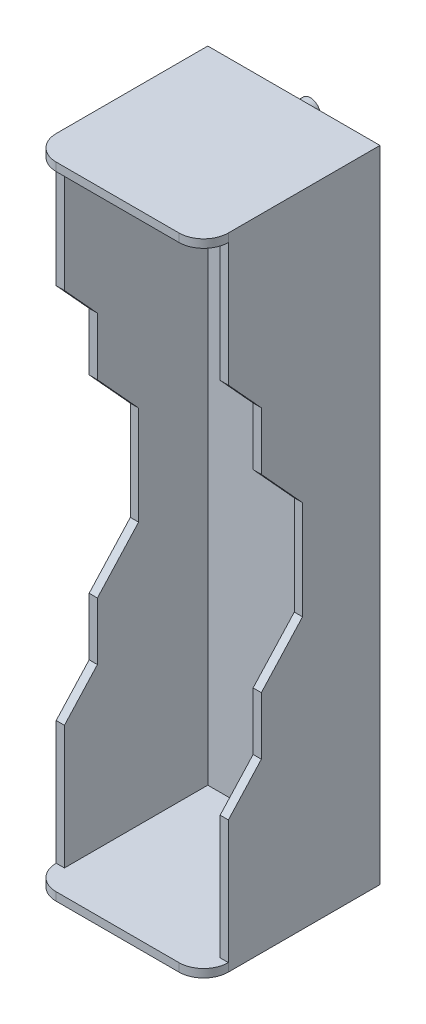
ISO-10303-21;
HEADER;
FILE_DESCRIPTION(('STEP AP214'),'2;1');
FILE_NAME('part.step','',(''),(''),'','','');
FILE_SCHEMA(('AUTOMOTIVE_DESIGN { 1 0 10303 214 1 1 1 1 }'));
ENDSEC;
DATA;
#1=APPLICATION_CONTEXT('core data for automotive mechanical design processes');
#2=APPLICATION_PROTOCOL_DEFINITION('international standard','automotive_design',2000,#1);
#3=PRODUCT_CONTEXT('',#1,'mechanical');
#4=PRODUCT('Part','Part','',(#3));
#5=PRODUCT_RELATED_PRODUCT_CATEGORY('part','',(#4));
#6=PRODUCT_DEFINITION_FORMATION('','',#4);
#7=PRODUCT_DEFINITION_CONTEXT('part definition',#1,'design');
#8=PRODUCT_DEFINITION('design','',#6,#7);
#9=PRODUCT_DEFINITION_SHAPE('','',#8);
#10=(LENGTH_UNIT() NAMED_UNIT(*) SI_UNIT(.MILLI.,.METRE.));
#11=(NAMED_UNIT(*) PLANE_ANGLE_UNIT() SI_UNIT($,.RADIAN.));
#12=(NAMED_UNIT(*) SI_UNIT($,.STERADIAN.) SOLID_ANGLE_UNIT());
#13=UNCERTAINTY_MEASURE_WITH_UNIT(LENGTH_MEASURE(1.E-05),#10,'distance_accuracy_value','');
#14=(GEOMETRIC_REPRESENTATION_CONTEXT(3) GLOBAL_UNCERTAINTY_ASSIGNED_CONTEXT((#13)) GLOBAL_UNIT_ASSIGNED_CONTEXT((#10,
#11,#12)) REPRESENTATION_CONTEXT('',''));
#15=CARTESIAN_POINT('',(0.,0.,0.));
#16=DIRECTION('',(0.,0.,1.));
#17=DIRECTION('',(1.,0.,0.));
#18=AXIS2_PLACEMENT_3D('',#15,#16,#17);
#19=CARTESIAN_POINT('',(-10.45,38.85,-21.4));
#20=DIRECTION('',(0.,0.,1.));
#21=DIRECTION('',(1.,0.,0.));
#22=AXIS2_PLACEMENT_3D('',#19,#20,#21);
#23=PLANE('',#22);
#24=CARTESIAN_POINT('',(0.,27.805,-21.4));
#25=DIRECTION('',(0.,0.,-1.));
#26=DIRECTION('',(1.,0.,0.));
#27=AXIS2_PLACEMENT_3D('',#24,#25,#26);
#28=CIRCLE('',#27,1.6);
#29=CARTESIAN_POINT('',(1.60000000000001,27.805,-21.4));
#30=VERTEX_POINT('',#29);
#31=EDGE_CURVE('E327',#30,#30,#28,.T.);
#32=ORIENTED_EDGE('',*,*,#31,.F.);
#33=EDGE_LOOP('',(#32));
#34=FACE_BOUND('',#33,.T.);
#35=CARTESIAN_POINT('',(0.,-27.805,-21.4));
#36=DIRECTION('',(0.,0.,-1.));
#37=DIRECTION('',(-1.,0.,0.));
#38=AXIS2_PLACEMENT_3D('',#35,#36,#37);
#39=CIRCLE('',#38,1.6);
#40=CARTESIAN_POINT('',(-1.6,-27.805,-21.4));
#41=VERTEX_POINT('',#40);
#42=EDGE_CURVE('E326',#41,#41,#39,.T.);
#43=ORIENTED_EDGE('',*,*,#42,.F.);
#44=EDGE_LOOP('',(#43));
#45=FACE_BOUND('',#44,.T.);
#46=DIRECTION('',(-1.,0.,0.));
#47=VECTOR('',#46,1.);
#48=CARTESIAN_POINT('',(-10.45,-38.85,-21.4));
#49=LINE('',#48,#47);
#50=CARTESIAN_POINT('',(10.45,-38.85,-21.4));
#51=VERTEX_POINT('',#50);
#52=CARTESIAN_POINT('',(-10.45,-38.85,-21.4));
#53=VERTEX_POINT('',#52);
#54=EDGE_CURVE('E361',#51,#53,#49,.T.);
#55=ORIENTED_EDGE('',*,*,#54,.T.);
#56=DIRECTION('',(0.,-1.,0.));
#57=VECTOR('',#56,1.);
#58=CARTESIAN_POINT('',(-10.45,38.85,-21.4));
#59=LINE('',#58,#57);
#60=CARTESIAN_POINT('',(-10.45,38.85,-21.4));
#61=VERTEX_POINT('',#60);
#62=EDGE_CURVE('E358',#61,#53,#59,.T.);
#63=ORIENTED_EDGE('',*,*,#62,.F.);
#64=DIRECTION('',(-1.,0.,0.));
#65=VECTOR('',#64,1.);
#66=CARTESIAN_POINT('',(-10.45,38.85,-21.4));
#67=LINE('',#66,#65);
#68=CARTESIAN_POINT('',(10.45,38.85,-21.4));
#69=VERTEX_POINT('',#68);
#70=EDGE_CURVE('E360',#69,#61,#67,.T.);
#71=ORIENTED_EDGE('',*,*,#70,.F.);
#72=DIRECTION('',(0.,-1.,0.));
#73=VECTOR('',#72,1.);
#74=CARTESIAN_POINT('',(10.45,38.85,-21.4));
#75=LINE('',#74,#73);
#76=EDGE_CURVE('E355',#69,#51,#75,.T.);
#77=ORIENTED_EDGE('',*,*,#76,.T.);
#78=EDGE_LOOP('',(#55,#63,#71,#77));
#79=FACE_BOUND('',#78,.T.);
#80=CARTESIAN_POINT('',(0.,-36.45,-21.4));
#81=DIRECTION('',(0.,0.,1.));
#82=DIRECTION('',(1.,0.,0.));
#83=AXIS2_PLACEMENT_3D('',#80,#81,#82);
#84=CIRCLE('',#83,1.2);
#85=CARTESIAN_POINT('',(1.2,-36.45,-21.4));
#86=VERTEX_POINT('',#85);
#87=EDGE_CURVE('E334',#86,#86,#84,.F.);
#88=ORIENTED_EDGE('',*,*,#87,.F.);
#89=EDGE_LOOP('',(#88));
#90=FACE_BOUND('',#89,.T.);
#91=CARTESIAN_POINT('',(0.,36.45,-21.4));
#92=DIRECTION('',(0.,0.,1.));
#93=DIRECTION('',(1.,0.,0.));
#94=AXIS2_PLACEMENT_3D('',#91,#92,#93);
#95=CIRCLE('',#94,1.2);
#96=CARTESIAN_POINT('',(1.2,36.45,-21.4));
#97=VERTEX_POINT('',#96);
#98=EDGE_CURVE('E322',#97,#97,#95,.F.);
#99=ORIENTED_EDGE('',*,*,#98,.F.);
#100=EDGE_LOOP('',(#99));
#101=FACE_BOUND('',#100,.T.);
#102=ADVANCED_FACE('F35',(#34,#45,#79,#90,#101),#23,.F.);
#103=CARTESIAN_POINT('',(-10.45,38.85,0.));
#104=DIRECTION('',(0.,0.,-1.));
#105=DIRECTION('',(-1.,0.,0.));
#106=AXIS2_PLACEMENT_3D('',#103,#104,#105);
#107=PLANE('',#106);
#108=DIRECTION('',(1.,0.,0.));
#109=VECTOR('',#108,1.);
#110=CARTESIAN_POINT('',(-10.45,38.85,0.));
#111=LINE('',#110,#109);
#112=CARTESIAN_POINT('',(-7.45,38.85,0.));
#113=VERTEX_POINT('',#112);
#114=CARTESIAN_POINT('',(7.45,38.85,0.));
#115=VERTEX_POINT('',#114);
#116=EDGE_CURVE('E373',#113,#115,#111,.T.);
#117=ORIENTED_EDGE('',*,*,#116,.F.);
#118=DIRECTION('',(0.,-1.,0.));
#119=VECTOR('',#118,1.);
#120=CARTESIAN_POINT('',(-7.45,38.85,0.));
#121=LINE('',#120,#119);
#122=CARTESIAN_POINT('',(-7.45,37.85,0.));
#123=VERTEX_POINT('',#122);
#124=EDGE_CURVE('E317',#113,#123,#121,.T.);
#125=ORIENTED_EDGE('',*,*,#124,.T.);
#126=DIRECTION('',(1.,0.,0.));
#127=VECTOR('',#126,1.);
#128=CARTESIAN_POINT('',(-9.45,37.85,0.));
#129=LINE('',#128,#127);
#130=CARTESIAN_POINT('',(7.45,37.85,0.));
#131=VERTEX_POINT('',#130);
#132=EDGE_CURVE('E392',#123,#131,#129,.T.);
#133=ORIENTED_EDGE('',*,*,#132,.T.);
#134=DIRECTION('',(0.,-1.,0.));
#135=VECTOR('',#134,1.);
#136=CARTESIAN_POINT('',(7.45,38.85,0.));
#137=LINE('',#136,#135);
#138=EDGE_CURVE('E320',#131,#115,#137,.F.);
#139=ORIENTED_EDGE('',*,*,#138,.T.);
#140=EDGE_LOOP('',(#117,#125,#133,#139));
#141=FACE_BOUND('',#140,.T.);
#142=ADVANCED_FACE('F506',(#141),#107,.F.);
#143=DIRECTION('',(-1.,0.,0.));
#144=VECTOR('',#143,1.);
#145=CARTESIAN_POINT('',(-9.45000000000001,-37.85,0.));
#146=LINE('',#145,#144);
#147=CARTESIAN_POINT('',(7.45,-37.85,0.));
#148=VERTEX_POINT('',#147);
#149=CARTESIAN_POINT('',(-7.45,-37.85,0.));
#150=VERTEX_POINT('',#149);
#151=EDGE_CURVE('E281',#148,#150,#146,.T.);
#152=ORIENTED_EDGE('',*,*,#151,.T.);
#153=DIRECTION('',(0.,-1.,0.));
#154=VECTOR('',#153,1.);
#155=CARTESIAN_POINT('',(-7.45,38.85,0.));
#156=LINE('',#155,#154);
#157=CARTESIAN_POINT('',(-7.45,-38.85,0.));
#158=VERTEX_POINT('',#157);
#159=EDGE_CURVE('E268',#150,#158,#156,.T.);
#160=ORIENTED_EDGE('',*,*,#159,.T.);
#161=DIRECTION('',(1.,0.,0.));
#162=VECTOR('',#161,1.);
#163=CARTESIAN_POINT('',(-10.45,-38.85,0.));
#164=LINE('',#163,#162);
#165=CARTESIAN_POINT('',(7.45,-38.85,0.));
#166=VERTEX_POINT('',#165);
#167=EDGE_CURVE('E366',#158,#166,#164,.T.);
#168=ORIENTED_EDGE('',*,*,#167,.T.);
#169=DIRECTION('',(0.,-1.,0.));
#170=VECTOR('',#169,1.);
#171=CARTESIAN_POINT('',(7.45,38.85,0.));
#172=LINE('',#171,#170);
#173=EDGE_CURVE('E270',#166,#148,#172,.F.);
#174=ORIENTED_EDGE('',*,*,#173,.T.);
#175=EDGE_LOOP('',(#152,#160,#168,#174));
#176=FACE_BOUND('',#175,.T.);
#177=ADVANCED_FACE('F608',(#176),#107,.F.);
#178=CARTESIAN_POINT('',(-10.45,38.85,-21.4));
#179=DIRECTION('',(1.,0.,0.));
#180=DIRECTION('',(0.,0.,-1.));
#181=AXIS2_PLACEMENT_3D('',#178,#179,#180);
#182=PLANE('',#181);
#183=DIRECTION('',(0.,1.,0.));
#184=VECTOR('',#183,1.);
#185=CARTESIAN_POINT('',(-10.45,37.85,-3.));
#186=LINE('',#185,#184);
#187=CARTESIAN_POINT('',(-10.45,22.85,-3.));
#188=VERTEX_POINT('',#187);
#189=CARTESIAN_POINT('',(-10.45,37.85,-3.));
#190=VERTEX_POINT('',#189);
#191=EDGE_CURVE('E295',#188,#190,#186,.T.);
#192=ORIENTED_EDGE('',*,*,#191,.T.);
#193=DIRECTION('',(0.,-1.,0.));
#194=VECTOR('',#193,1.);
#195=CARTESIAN_POINT('',(-10.45,38.85,-3.));
#196=LINE('',#195,#194);
#197=CARTESIAN_POINT('',(-10.45,38.85,-3.));
#198=VERTEX_POINT('',#197);
#199=EDGE_CURVE('E244',#190,#198,#196,.F.);
#200=ORIENTED_EDGE('',*,*,#199,.T.);
#201=DIRECTION('',(0.,0.,1.));
#202=VECTOR('',#201,1.);
#203=CARTESIAN_POINT('',(-10.45,38.85,-21.4));
#204=LINE('',#203,#202);
#205=EDGE_CURVE('E363',#61,#198,#204,.T.);
#206=ORIENTED_EDGE('',*,*,#205,.F.);
#207=ORIENTED_EDGE('',*,*,#62,.T.);
#208=DIRECTION('',(0.,0.,1.));
#209=VECTOR('',#208,1.);
#210=CARTESIAN_POINT('',(-10.45,-38.85,-21.4));
#211=LINE('',#210,#209);
#212=CARTESIAN_POINT('',(-10.45,-38.85,-3.));
#213=VERTEX_POINT('',#212);
#214=EDGE_CURVE('E242',#53,#213,#211,.T.);
#215=ORIENTED_EDGE('',*,*,#214,.T.);
#216=DIRECTION('',(0.,-1.,0.));
#217=VECTOR('',#216,1.);
#218=CARTESIAN_POINT('',(-10.45,38.85,-3.));
#219=LINE('',#218,#217);
#220=CARTESIAN_POINT('',(-10.45,-37.85,-3.));
#221=VERTEX_POINT('',#220);
#222=EDGE_CURVE('E233',#213,#221,#219,.F.);
#223=ORIENTED_EDGE('',*,*,#222,.T.);
#224=DIRECTION('',(0.,1.,0.));
#225=VECTOR('',#224,1.);
#226=CARTESIAN_POINT('',(-10.45,-37.85,-3.));
#227=LINE('',#226,#225);
#228=CARTESIAN_POINT('',(-10.45,-22.85,-3.));
#229=VERTEX_POINT('',#228);
#230=EDGE_CURVE('E239',#221,#229,#227,.T.);
#231=ORIENTED_EDGE('',*,*,#230,.T.);
#232=DIRECTION('',(0.,0.738242056578347,-0.674535889259403));
#233=VECTOR('',#232,1.);
#234=CARTESIAN_POINT('',(-10.45,-22.85,-3.));
#235=LINE('',#234,#233);
#236=CARTESIAN_POINT('',(-10.45,-18.4722222222222,-7.));
#237=VERTEX_POINT('',#236);
#238=EDGE_CURVE('E264',#229,#237,#235,.T.);
#239=ORIENTED_EDGE('',*,*,#238,.T.);
#240=DIRECTION('',(0.,1.,0.));
#241=VECTOR('',#240,1.);
#242=CARTESIAN_POINT('',(-10.45,-18.4722222222222,-7.));
#243=LINE('',#242,#241);
#244=CARTESIAN_POINT('',(-10.45,-11.4722222222222,-7.));
#245=VERTEX_POINT('',#244);
#246=EDGE_CURVE('E489',#237,#245,#243,.T.);
#247=ORIENTED_EDGE('',*,*,#246,.T.);
#248=DIRECTION('',(0.,0.738242056578347,-0.674535889259403));
#249=VECTOR('',#248,1.);
#250=CARTESIAN_POINT('',(-10.45,-11.4722222222222,-7.));
#251=LINE('',#250,#249);
#252=CARTESIAN_POINT('',(-10.45,-6.,-12.));
#253=VERTEX_POINT('',#252);
#254=EDGE_CURVE('E486',#245,#253,#251,.T.);
#255=ORIENTED_EDGE('',*,*,#254,.T.);
#256=DIRECTION('',(0.,1.,0.));
#257=VECTOR('',#256,1.);
#258=CARTESIAN_POINT('',(-10.45,6.,-12.));
#259=LINE('',#258,#257);
#260=CARTESIAN_POINT('',(-10.45,6.,-12.));
#261=VERTEX_POINT('',#260);
#262=EDGE_CURVE('E483',#253,#261,#259,.T.);
#263=ORIENTED_EDGE('',*,*,#262,.T.);
#264=DIRECTION('',(0.,0.738242056578347,0.674535889259403));
#265=VECTOR('',#264,1.);
#266=CARTESIAN_POINT('',(-10.45,11.4722222222222,-7.));
#267=LINE('',#266,#265);
#268=CARTESIAN_POINT('',(-10.45,11.4722222222222,-7.));
#269=VERTEX_POINT('',#268);
#270=EDGE_CURVE('E480',#261,#269,#267,.T.);
#271=ORIENTED_EDGE('',*,*,#270,.T.);
#272=DIRECTION('',(0.,1.,0.));
#273=VECTOR('',#272,1.);
#274=CARTESIAN_POINT('',(-10.45,18.4722222222222,-7.));
#275=LINE('',#274,#273);
#276=CARTESIAN_POINT('',(-10.45,18.4722222222222,-7.));
#277=VERTEX_POINT('',#276);
#278=EDGE_CURVE('E477',#269,#277,#275,.T.);
#279=ORIENTED_EDGE('',*,*,#278,.T.);
#280=DIRECTION('',(0.,0.738242056578347,0.674535889259403));
#281=VECTOR('',#280,1.);
#282=CARTESIAN_POINT('',(-10.45,22.85,-3.));
#283=LINE('',#282,#281);
#284=EDGE_CURVE('E474',#277,#188,#283,.T.);
#285=ORIENTED_EDGE('',*,*,#284,.T.);
#286=EDGE_LOOP('',(#192,#200,#206,#207,#215,#223,#231,#239,#247,#255,#263,#271,#279,#285));
#287=FACE_BOUND('',#286,.T.);
#288=ADVANCED_FACE('F236',(#287),#182,.F.);
#289=CARTESIAN_POINT('',(10.45,38.85,-21.4));
#290=DIRECTION('',(-1.,0.,0.));
#291=DIRECTION('',(0.,0.,1.));
#292=AXIS2_PLACEMENT_3D('',#289,#290,#291);
#293=PLANE('',#292);
#294=DIRECTION('',(0.,0.,-1.));
#295=VECTOR('',#294,1.);
#296=CARTESIAN_POINT('',(10.45,38.85,-21.4));
#297=LINE('',#296,#295);
#298=CARTESIAN_POINT('',(10.45,38.85,-3.));
#299=VERTEX_POINT('',#298);
#300=EDGE_CURVE('E371',#299,#69,#297,.T.);
#301=ORIENTED_EDGE('',*,*,#300,.F.);
#302=DIRECTION('',(0.,-1.,0.));
#303=VECTOR('',#302,1.);
#304=CARTESIAN_POINT('',(10.45,38.85,-3.));
#305=LINE('',#304,#303);
#306=CARTESIAN_POINT('',(10.45,37.85,-3.));
#307=VERTEX_POINT('',#306);
#308=EDGE_CURVE('E273',#299,#307,#305,.T.);
#309=ORIENTED_EDGE('',*,*,#308,.T.);
#310=DIRECTION('',(0.,1.,0.));
#311=VECTOR('',#310,1.);
#312=CARTESIAN_POINT('',(10.45,37.85,-3.));
#313=LINE('',#312,#311);
#314=CARTESIAN_POINT('',(10.45,22.85,-3.));
#315=VERTEX_POINT('',#314);
#316=EDGE_CURVE('E265',#315,#307,#313,.T.);
#317=ORIENTED_EDGE('',*,*,#316,.F.);
#318=DIRECTION('',(0.,0.738242056578347,0.674535889259403));
#319=VECTOR('',#318,1.);
#320=CARTESIAN_POINT('',(10.45,22.85,-3.));
#321=LINE('',#320,#319);
#322=CARTESIAN_POINT('',(10.45,18.4722222222222,-7.));
#323=VERTEX_POINT('',#322);
#324=EDGE_CURVE('E454',#323,#315,#321,.T.);
#325=ORIENTED_EDGE('',*,*,#324,.F.);
#326=DIRECTION('',(0.,1.,0.));
#327=VECTOR('',#326,1.);
#328=CARTESIAN_POINT('',(10.45,18.4722222222222,-7.));
#329=LINE('',#328,#327);
#330=CARTESIAN_POINT('',(10.45,11.4722222222222,-7.));
#331=VERTEX_POINT('',#330);
#332=EDGE_CURVE('E457',#331,#323,#329,.T.);
#333=ORIENTED_EDGE('',*,*,#332,.F.);
#334=DIRECTION('',(0.,0.738242056578347,0.674535889259403));
#335=VECTOR('',#334,1.);
#336=CARTESIAN_POINT('',(10.45,11.4722222222222,-7.));
#337=LINE('',#336,#335);
#338=CARTESIAN_POINT('',(10.45,6.,-12.));
#339=VERTEX_POINT('',#338);
#340=EDGE_CURVE('E460',#339,#331,#337,.T.);
#341=ORIENTED_EDGE('',*,*,#340,.F.);
#342=DIRECTION('',(0.,1.,0.));
#343=VECTOR('',#342,1.);
#344=CARTESIAN_POINT('',(10.45,6.,-12.));
#345=LINE('',#344,#343);
#346=CARTESIAN_POINT('',(10.45,-6.,-12.));
#347=VERTEX_POINT('',#346);
#348=EDGE_CURVE('E463',#347,#339,#345,.T.);
#349=ORIENTED_EDGE('',*,*,#348,.F.);
#350=DIRECTION('',(0.,0.738242056578347,-0.674535889259403));
#351=VECTOR('',#350,1.);
#352=CARTESIAN_POINT('',(10.45,-11.4722222222222,-7.));
#353=LINE('',#352,#351);
#354=CARTESIAN_POINT('',(10.45,-11.4722222222222,-7.));
#355=VERTEX_POINT('',#354);
#356=EDGE_CURVE('E466',#355,#347,#353,.T.);
#357=ORIENTED_EDGE('',*,*,#356,.F.);
#358=DIRECTION('',(0.,1.,0.));
#359=VECTOR('',#358,1.);
#360=CARTESIAN_POINT('',(10.45,-18.4722222222222,-7.));
#361=LINE('',#360,#359);
#362=CARTESIAN_POINT('',(10.45,-18.4722222222222,-7.));
#363=VERTEX_POINT('',#362);
#364=EDGE_CURVE('E469',#363,#355,#361,.T.);
#365=ORIENTED_EDGE('',*,*,#364,.F.);
#366=DIRECTION('',(0.,0.738242056578347,-0.674535889259403));
#367=VECTOR('',#366,1.);
#368=CARTESIAN_POINT('',(10.45,-22.85,-3.));
#369=LINE('',#368,#367);
#370=CARTESIAN_POINT('',(10.45,-22.85,-3.));
#371=VERTEX_POINT('',#370);
#372=EDGE_CURVE('E303',#371,#363,#369,.T.);
#373=ORIENTED_EDGE('',*,*,#372,.F.);
#374=DIRECTION('',(0.,1.,0.));
#375=VECTOR('',#374,1.);
#376=CARTESIAN_POINT('',(10.45,-37.85,-3.));
#377=LINE('',#376,#375);
#378=CARTESIAN_POINT('',(10.45,-37.85,-3.));
#379=VERTEX_POINT('',#378);
#380=EDGE_CURVE('E290',#379,#371,#377,.T.);
#381=ORIENTED_EDGE('',*,*,#380,.F.);
#382=DIRECTION('',(0.,-1.,0.));
#383=VECTOR('',#382,1.);
#384=CARTESIAN_POINT('',(10.45,38.85,-3.));
#385=LINE('',#384,#383);
#386=CARTESIAN_POINT('',(10.45,-38.85,-3.));
#387=VERTEX_POINT('',#386);
#388=EDGE_CURVE('E300',#379,#387,#385,.T.);
#389=ORIENTED_EDGE('',*,*,#388,.T.);
#390=DIRECTION('',(0.,0.,-1.));
#391=VECTOR('',#390,1.);
#392=CARTESIAN_POINT('',(10.45,-38.85,-21.4));
#393=LINE('',#392,#391);
#394=EDGE_CURVE('E364',#387,#51,#393,.T.);
#395=ORIENTED_EDGE('',*,*,#394,.T.);
#396=ORIENTED_EDGE('',*,*,#76,.F.);
#397=EDGE_LOOP('',(#301,#309,#317,#325,#333,#341,#349,#357,#365,#373,#381,#389,#395,#396));
#398=FACE_BOUND('',#397,.T.);
#399=ADVANCED_FACE('F299',(#398),#293,.F.);
#400=CARTESIAN_POINT('',(0.,38.85,0.));
#401=DIRECTION('',(0.,1.,0.));
#402=DIRECTION('',(0.,0.,1.));
#403=AXIS2_PLACEMENT_3D('',#400,#401,#402);
#404=PLANE('',#403);
#405=ORIENTED_EDGE('',*,*,#205,.T.);
#406=CARTESIAN_POINT('',(-7.45,38.85,-3.));
#407=DIRECTION('',(0.,1.,0.));
#408=DIRECTION('',(0.,0.,1.));
#409=AXIS2_PLACEMENT_3D('',#406,#407,#408);
#410=CIRCLE('',#409,3.);
#411=EDGE_CURVE('E306',#198,#113,#410,.T.);
#412=ORIENTED_EDGE('',*,*,#411,.T.);
#413=ORIENTED_EDGE('',*,*,#116,.T.);
#414=CARTESIAN_POINT('',(7.45,38.85,-3.));
#415=DIRECTION('',(0.,1.,0.));
#416=DIRECTION('',(0.,0.,1.));
#417=AXIS2_PLACEMENT_3D('',#414,#415,#416);
#418=CIRCLE('',#417,3.);
#419=EDGE_CURVE('E309',#115,#299,#418,.T.);
#420=ORIENTED_EDGE('',*,*,#419,.T.);
#421=ORIENTED_EDGE('',*,*,#300,.T.);
#422=ORIENTED_EDGE('',*,*,#70,.T.);
#423=EDGE_LOOP('',(#405,#412,#413,#420,#421,#422));
#424=FACE_BOUND('',#423,.T.);
#425=ADVANCED_FACE('F600',(#424),#404,.T.);
#426=CARTESIAN_POINT('',(0.,-38.85,0.));
#427=DIRECTION('',(0.,1.,0.));
#428=DIRECTION('',(0.,0.,1.));
#429=AXIS2_PLACEMENT_3D('',#426,#427,#428);
#430=PLANE('',#429);
#431=ORIENTED_EDGE('',*,*,#167,.F.);
#432=CARTESIAN_POINT('',(-7.45,-38.85,-3.));
#433=DIRECTION('',(0.,1.,0.));
#434=DIRECTION('',(0.,0.,1.));
#435=AXIS2_PLACEMENT_3D('',#432,#433,#434);
#436=CIRCLE('',#435,3.);
#437=EDGE_CURVE('E58',#158,#213,#436,.F.);
#438=ORIENTED_EDGE('',*,*,#437,.T.);
#439=ORIENTED_EDGE('',*,*,#214,.F.);
#440=ORIENTED_EDGE('',*,*,#54,.F.);
#441=ORIENTED_EDGE('',*,*,#394,.F.);
#442=CARTESIAN_POINT('',(7.45,-38.85,-3.));
#443=DIRECTION('',(0.,1.,0.));
#444=DIRECTION('',(0.,0.,1.));
#445=AXIS2_PLACEMENT_3D('',#442,#443,#444);
#446=CIRCLE('',#445,3.);
#447=EDGE_CURVE('E50',#387,#166,#446,.F.);
#448=ORIENTED_EDGE('',*,*,#447,.T.);
#449=EDGE_LOOP('',(#431,#438,#439,#440,#441,#448));
#450=FACE_BOUND('',#449,.T.);
#451=ADVANCED_FACE('F589',(#450),#430,.F.);
#452=CARTESIAN_POINT('',(-9.45000000000001,-37.85,-99.4237143437814));
#453=DIRECTION('',(0.,1.,0.));
#454=DIRECTION('',(0.,0.,1.));
#455=AXIS2_PLACEMENT_3D('',#452,#453,#454);
#456=PLANE('',#455);
#457=DIRECTION('',(1.,0.,0.));
#458=VECTOR('',#457,1.);
#459=CARTESIAN_POINT('',(-10.45,-37.85,-3.));
#460=LINE('',#459,#458);
#461=CARTESIAN_POINT('',(-9.45000000000001,-37.85,-3.));
#462=VERTEX_POINT('',#461);
#463=EDGE_CURVE('E249',#221,#462,#460,.T.);
#464=ORIENTED_EDGE('',*,*,#463,.F.);
#465=CARTESIAN_POINT('',(-7.45,-37.85,-3.));
#466=DIRECTION('',(0.,1.,0.));
#467=DIRECTION('',(0.,0.,1.));
#468=AXIS2_PLACEMENT_3D('',#465,#466,#467);
#469=CIRCLE('',#468,3.);
#470=EDGE_CURVE('E12',#221,#150,#469,.T.);
#471=ORIENTED_EDGE('',*,*,#470,.T.);
#472=ORIENTED_EDGE('',*,*,#151,.F.);
#473=CARTESIAN_POINT('',(7.45,-37.85,-3.));
#474=DIRECTION('',(0.,1.,0.));
#475=DIRECTION('',(0.,0.,1.));
#476=AXIS2_PLACEMENT_3D('',#473,#474,#475);
#477=CIRCLE('',#476,3.);
#478=EDGE_CURVE('E43',#148,#379,#477,.T.);
#479=ORIENTED_EDGE('',*,*,#478,.T.);
#480=CARTESIAN_POINT('',(9.44999999999999,-37.85,-3.));
#481=VERTEX_POINT('',#480);
#482=EDGE_CURVE('E258',#481,#379,#460,.T.);
#483=ORIENTED_EDGE('',*,*,#482,.F.);
#484=DIRECTION('',(0.,0.,1.));
#485=VECTOR('',#484,1.);
#486=CARTESIAN_POINT('',(9.44999999999999,-37.85,-99.4237143437814));
#487=LINE('',#486,#485);
#488=CARTESIAN_POINT('',(9.44999999999999,-37.85,-20.4));
#489=VERTEX_POINT('',#488);
#490=EDGE_CURVE('E388',#489,#481,#487,.T.);
#491=ORIENTED_EDGE('',*,*,#490,.F.);
#492=DIRECTION('',(1.,0.,0.));
#493=VECTOR('',#492,1.);
#494=CARTESIAN_POINT('',(-9.45000000000001,-37.85,-20.4));
#495=LINE('',#494,#493);
#496=CARTESIAN_POINT('',(-9.45000000000001,-37.85,-20.4));
#497=VERTEX_POINT('',#496);
#498=EDGE_CURVE('E378',#497,#489,#495,.T.);
#499=ORIENTED_EDGE('',*,*,#498,.F.);
#500=DIRECTION('',(0.,0.,1.));
#501=VECTOR('',#500,1.);
#502=CARTESIAN_POINT('',(-9.45000000000001,-37.85,-99.4237143437814));
#503=LINE('',#502,#501);
#504=EDGE_CURVE('E254',#497,#462,#503,.T.);
#505=ORIENTED_EDGE('',*,*,#504,.T.);
#506=EDGE_LOOP('',(#464,#471,#472,#479,#483,#491,#499,#505));
#507=FACE_BOUND('',#506,.T.);
#508=ADVANCED_FACE('F250',(#507),#456,.T.);
#509=CARTESIAN_POINT('',(9.45,37.85,-99.4237143437814));
#510=DIRECTION('',(-1.,0.,0.));
#511=DIRECTION('',(0.,-1.,0.));
#512=AXIS2_PLACEMENT_3D('',#509,#510,#511);
#513=PLANE('',#512);
#514=DIRECTION('',(0.,-1.,0.));
#515=VECTOR('',#514,1.);
#516=CARTESIAN_POINT('',(9.45,37.85,-3.));
#517=LINE('',#516,#515);
#518=CARTESIAN_POINT('',(9.44999999999999,37.85,-3.));
#519=VERTEX_POINT('',#518);
#520=CARTESIAN_POINT('',(9.44999999999999,22.85,-3.));
#521=VERTEX_POINT('',#520);
#522=EDGE_CURVE('E395',#519,#521,#517,.T.);
#523=ORIENTED_EDGE('',*,*,#522,.F.);
#524=DIRECTION('',(0.,0.,1.));
#525=VECTOR('',#524,1.);
#526=CARTESIAN_POINT('',(9.45,37.85,-99.4237143437814));
#527=LINE('',#526,#525);
#528=CARTESIAN_POINT('',(9.45,37.85,-20.4));
#529=VERTEX_POINT('',#528);
#530=EDGE_CURVE('E385',#529,#519,#527,.T.);
#531=ORIENTED_EDGE('',*,*,#530,.F.);
#532=DIRECTION('',(0.,1.,0.));
#533=VECTOR('',#532,1.);
#534=CARTESIAN_POINT('',(9.45,37.85,-20.4));
#535=LINE('',#534,#533);
#536=EDGE_CURVE('E381',#489,#529,#535,.T.);
#537=ORIENTED_EDGE('',*,*,#536,.F.);
#538=ORIENTED_EDGE('',*,*,#490,.T.);
#539=DIRECTION('',(0.,-1.,0.));
#540=VECTOR('',#539,1.);
#541=CARTESIAN_POINT('',(9.45,37.85,-3.));
#542=LINE('',#541,#540);
#543=CARTESIAN_POINT('',(9.44999999999999,-22.85,-3.));
#544=VERTEX_POINT('',#543);
#545=EDGE_CURVE('E293',#544,#481,#542,.T.);
#546=ORIENTED_EDGE('',*,*,#545,.F.);
#547=DIRECTION('',(0.,-0.738242056578347,0.674535889259403));
#548=VECTOR('',#547,1.);
#549=CARTESIAN_POINT('',(9.45,58.247771498413,-77.0994866482961));
#550=LINE('',#549,#548);
#551=CARTESIAN_POINT('',(9.44999999999999,-18.4722222222222,-7.));
#552=VERTEX_POINT('',#551);
#553=EDGE_CURVE('E416',#552,#544,#550,.T.);
#554=ORIENTED_EDGE('',*,*,#553,.F.);
#555=DIRECTION('',(0.,-1.,0.));
#556=VECTOR('',#555,1.);
#557=CARTESIAN_POINT('',(9.45,37.85,-7.00000000000001));
#558=LINE('',#557,#556);
#559=CARTESIAN_POINT('',(9.44999999999999,-11.4722222222222,-7.));
#560=VERTEX_POINT('',#559);
#561=EDGE_CURVE('E414',#560,#552,#558,.T.);
#562=ORIENTED_EDGE('',*,*,#561,.F.);
#563=DIRECTION('',(0.,-0.738242056578347,0.674535889259403));
#564=VECTOR('',#563,1.);
#565=CARTESIAN_POINT('',(9.45,61.4327621597058,-73.6136913134367));
#566=LINE('',#565,#564);
#567=CARTESIAN_POINT('',(9.44999999999999,-6.,-12.));
#568=VERTEX_POINT('',#567);
#569=EDGE_CURVE('E412',#568,#560,#566,.T.);
#570=ORIENTED_EDGE('',*,*,#569,.F.);
#571=DIRECTION('',(0.,-1.,0.));
#572=VECTOR('',#571,1.);
#573=CARTESIAN_POINT('',(9.45,37.85,-12.));
#574=LINE('',#573,#572);
#575=CARTESIAN_POINT('',(9.44999999999999,6.,-12.));
#576=VERTEX_POINT('',#575);
#577=EDGE_CURVE('E410',#576,#568,#574,.T.);
#578=ORIENTED_EDGE('',*,*,#577,.F.);
#579=DIRECTION('',(0.,-0.738242056578347,-0.674535889259403));
#580=VECTOR('',#579,1.);
#581=CARTESIAN_POINT('',(9.44999999999999,-20.1761611682581,-35.9173046207434));
#582=LINE('',#581,#580);
#583=CARTESIAN_POINT('',(9.44999999999999,11.4722222222222,-7.));
#584=VERTEX_POINT('',#583);
#585=EDGE_CURVE('E408',#584,#576,#582,.T.);
#586=ORIENTED_EDGE('',*,*,#585,.F.);
#587=DIRECTION('',(0.,-1.,0.));
#588=VECTOR('',#587,1.);
#589=CARTESIAN_POINT('',(9.45,37.85,-7.00000000000001));
#590=LINE('',#589,#588);
#591=CARTESIAN_POINT('',(9.44999999999999,18.4722222222222,-7.));
#592=VERTEX_POINT('',#591);
#593=EDGE_CURVE('E406',#592,#584,#590,.T.);
#594=ORIENTED_EDGE('',*,*,#593,.F.);
#595=DIRECTION('',(0.,-0.738242056578347,-0.674535889259403));
#596=VECTOR('',#595,1.);
#597=CARTESIAN_POINT('',(9.44999999999999,-16.9911705069652,-39.4030999556028));
#598=LINE('',#597,#596);
#599=EDGE_CURVE('E404',#521,#592,#598,.T.);
#600=ORIENTED_EDGE('',*,*,#599,.F.);
#601=EDGE_LOOP('',(#523,#531,#537,#538,#546,#554,#562,#570,#578,#586,#594,#600));
#602=FACE_BOUND('',#601,.T.);
#603=ADVANCED_FACE('F588',(#602),#513,.T.);
#604=CARTESIAN_POINT('',(-9.45,37.85,-99.4237143437814));
#605=DIRECTION('',(0.,-1.,0.));
#606=DIRECTION('',(0.,0.,-1.));
#607=AXIS2_PLACEMENT_3D('',#604,#605,#606);
#608=PLANE('',#607);
#609=ORIENTED_EDGE('',*,*,#132,.F.);
#610=CARTESIAN_POINT('',(-7.45,37.85,-3.));
#611=DIRECTION('',(0.,-1.,0.));
#612=DIRECTION('',(0.,0.,-1.));
#613=AXIS2_PLACEMENT_3D('',#610,#611,#612);
#614=CIRCLE('',#613,3.);
#615=EDGE_CURVE('E245',#123,#190,#614,.T.);
#616=ORIENTED_EDGE('',*,*,#615,.T.);
#617=DIRECTION('',(1.,0.,0.));
#618=VECTOR('',#617,1.);
#619=CARTESIAN_POINT('',(-10.45,37.85,-3.));
#620=LINE('',#619,#618);
#621=CARTESIAN_POINT('',(-9.45,37.85,-3.));
#622=VERTEX_POINT('',#621);
#623=EDGE_CURVE('E418',#190,#622,#620,.T.);
#624=ORIENTED_EDGE('',*,*,#623,.T.);
#625=DIRECTION('',(0.,0.,1.));
#626=VECTOR('',#625,1.);
#627=CARTESIAN_POINT('',(-9.45,37.85,-99.4237143437814));
#628=LINE('',#627,#626);
#629=CARTESIAN_POINT('',(-9.45,37.85,-20.4));
#630=VERTEX_POINT('',#629);
#631=EDGE_CURVE('E382',#630,#622,#628,.T.);
#632=ORIENTED_EDGE('',*,*,#631,.F.);
#633=DIRECTION('',(-1.,0.,0.));
#634=VECTOR('',#633,1.);
#635=CARTESIAN_POINT('',(-9.45,37.85,-20.4));
#636=LINE('',#635,#634);
#637=EDGE_CURVE('E398',#529,#630,#636,.T.);
#638=ORIENTED_EDGE('',*,*,#637,.F.);
#639=ORIENTED_EDGE('',*,*,#530,.T.);
#640=EDGE_CURVE('E449',#519,#307,#620,.T.);
#641=ORIENTED_EDGE('',*,*,#640,.T.);
#642=CARTESIAN_POINT('',(7.45,37.85,-3.));
#643=DIRECTION('',(0.,-1.,0.));
#644=DIRECTION('',(0.,0.,-1.));
#645=AXIS2_PLACEMENT_3D('',#642,#643,#644);
#646=CIRCLE('',#645,3.);
#647=EDGE_CURVE('E315',#307,#131,#646,.T.);
#648=ORIENTED_EDGE('',*,*,#647,.T.);
#649=EDGE_LOOP('',(#609,#616,#624,#632,#638,#639,#641,#648));
#650=FACE_BOUND('',#649,.T.);
#651=ADVANCED_FACE('F592',(#650),#608,.T.);
#652=CARTESIAN_POINT('',(-9.45,37.85,-99.4237143437814));
#653=DIRECTION('',(1.,0.,0.));
#654=DIRECTION('',(0.,1.,0.));
#655=AXIS2_PLACEMENT_3D('',#652,#653,#654);
#656=PLANE('',#655);
#657=DIRECTION('',(0.,1.,0.));
#658=VECTOR('',#657,1.);
#659=CARTESIAN_POINT('',(-9.45,37.85,-3.));
#660=LINE('',#659,#658);
#661=CARTESIAN_POINT('',(-9.45,22.85,-3.));
#662=VERTEX_POINT('',#661);
#663=EDGE_CURVE('E337',#662,#622,#660,.T.);
#664=ORIENTED_EDGE('',*,*,#663,.F.);
#665=DIRECTION('',(0.,0.738242056578347,0.674535889259403));
#666=VECTOR('',#665,1.);
#667=CARTESIAN_POINT('',(-9.45000000000001,-16.9911705069652,-39.4030999556028));
#668=LINE('',#667,#666);
#669=CARTESIAN_POINT('',(-9.45,18.4722222222222,-7.));
#670=VERTEX_POINT('',#669);
#671=EDGE_CURVE('E339',#670,#662,#668,.T.);
#672=ORIENTED_EDGE('',*,*,#671,.F.);
#673=DIRECTION('',(0.,1.,0.));
#674=VECTOR('',#673,1.);
#675=CARTESIAN_POINT('',(-9.45,37.85,-7.00000000000001));
#676=LINE('',#675,#674);
#677=CARTESIAN_POINT('',(-9.45,11.4722222222222,-7.));
#678=VERTEX_POINT('',#677);
#679=EDGE_CURVE('E341',#678,#670,#676,.T.);
#680=ORIENTED_EDGE('',*,*,#679,.F.);
#681=DIRECTION('',(0.,0.738242056578347,0.674535889259403));
#682=VECTOR('',#681,1.);
#683=CARTESIAN_POINT('',(-9.45000000000001,-20.1761611682581,-35.9173046207434));
#684=LINE('',#683,#682);
#685=CARTESIAN_POINT('',(-9.45,6.,-12.));
#686=VERTEX_POINT('',#685);
#687=EDGE_CURVE('E343',#686,#678,#684,.T.);
#688=ORIENTED_EDGE('',*,*,#687,.F.);
#689=DIRECTION('',(0.,1.,0.));
#690=VECTOR('',#689,1.);
#691=CARTESIAN_POINT('',(-9.45,37.85,-12.));
#692=LINE('',#691,#690);
#693=CARTESIAN_POINT('',(-9.45,-6.,-12.));
#694=VERTEX_POINT('',#693);
#695=EDGE_CURVE('E345',#694,#686,#692,.T.);
#696=ORIENTED_EDGE('',*,*,#695,.F.);
#697=DIRECTION('',(0.,0.738242056578347,-0.674535889259403));
#698=VECTOR('',#697,1.);
#699=CARTESIAN_POINT('',(-9.45,61.4327621597058,-73.6136913134367));
#700=LINE('',#699,#698);
#701=CARTESIAN_POINT('',(-9.45000000000001,-11.4722222222222,-7.));
#702=VERTEX_POINT('',#701);
#703=EDGE_CURVE('E347',#702,#694,#700,.T.);
#704=ORIENTED_EDGE('',*,*,#703,.F.);
#705=DIRECTION('',(0.,1.,0.));
#706=VECTOR('',#705,1.);
#707=CARTESIAN_POINT('',(-9.45,37.85,-7.00000000000001));
#708=LINE('',#707,#706);
#709=CARTESIAN_POINT('',(-9.45000000000001,-18.4722222222222,-7.));
#710=VERTEX_POINT('',#709);
#711=EDGE_CURVE('E349',#710,#702,#708,.T.);
#712=ORIENTED_EDGE('',*,*,#711,.F.);
#713=DIRECTION('',(0.,0.738242056578347,-0.674535889259403));
#714=VECTOR('',#713,1.);
#715=CARTESIAN_POINT('',(-9.45,58.247771498413,-77.0994866482961));
#716=LINE('',#715,#714);
#717=CARTESIAN_POINT('',(-9.45000000000001,-22.85,-3.));
#718=VERTEX_POINT('',#717);
#719=EDGE_CURVE('E351',#718,#710,#716,.T.);
#720=ORIENTED_EDGE('',*,*,#719,.F.);
#721=DIRECTION('',(0.,1.,0.));
#722=VECTOR('',#721,1.);
#723=CARTESIAN_POINT('',(-9.45,37.85,-3.));
#724=LINE('',#723,#722);
#725=EDGE_CURVE('E353',#462,#718,#724,.T.);
#726=ORIENTED_EDGE('',*,*,#725,.F.);
#727=ORIENTED_EDGE('',*,*,#504,.F.);
#728=DIRECTION('',(0.,-1.,0.));
#729=VECTOR('',#728,1.);
#730=CARTESIAN_POINT('',(-9.45,37.85,-20.4));
#731=LINE('',#730,#729);
#732=EDGE_CURVE('E369',#630,#497,#731,.T.);
#733=ORIENTED_EDGE('',*,*,#732,.F.);
#734=ORIENTED_EDGE('',*,*,#631,.T.);
#735=EDGE_LOOP('',(#664,#672,#680,#688,#696,#704,#712,#720,#726,#727,#733,#734));
#736=FACE_BOUND('',#735,.T.);
#737=ADVANCED_FACE('F584',(#736),#656,.T.);
#738=CARTESIAN_POINT('',(-10.45,38.85,-20.4));
#739=DIRECTION('',(0.,0.,1.));
#740=DIRECTION('',(1.,0.,0.));
#741=AXIS2_PLACEMENT_3D('',#738,#739,#740);
#742=PLANE('',#741);
#743=CARTESIAN_POINT('',(0.,27.805,-20.4));
#744=DIRECTION('',(0.,0.,1.));
#745=DIRECTION('',(1.,0.,0.));
#746=AXIS2_PLACEMENT_3D('',#743,#744,#745);
#747=CIRCLE('',#746,1.6);
#748=CARTESIAN_POINT('',(1.60000000000001,27.805,-20.4));
#749=VERTEX_POINT('',#748);
#750=EDGE_CURVE('E323',#749,#749,#747,.T.);
#751=ORIENTED_EDGE('',*,*,#750,.F.);
#752=EDGE_LOOP('',(#751));
#753=FACE_BOUND('',#752,.T.);
#754=CARTESIAN_POINT('',(0.,-27.805,-20.4));
#755=DIRECTION('',(0.,0.,1.));
#756=DIRECTION('',(1.,0.,0.));
#757=AXIS2_PLACEMENT_3D('',#754,#755,#756);
#758=CIRCLE('',#757,1.6);
#759=CARTESIAN_POINT('',(1.6,-27.805,-20.4));
#760=VERTEX_POINT('',#759);
#761=EDGE_CURVE('E328',#760,#760,#758,.T.);
#762=ORIENTED_EDGE('',*,*,#761,.F.);
#763=EDGE_LOOP('',(#762));
#764=FACE_BOUND('',#763,.T.);
#765=ORIENTED_EDGE('',*,*,#637,.T.);
#766=ORIENTED_EDGE('',*,*,#732,.T.);
#767=ORIENTED_EDGE('',*,*,#498,.T.);
#768=ORIENTED_EDGE('',*,*,#536,.T.);
#769=EDGE_LOOP('',(#765,#766,#767,#768));
#770=FACE_BOUND('',#769,.T.);
#771=ADVANCED_FACE('F581',(#753,#764,#770),#742,.T.);
#772=CARTESIAN_POINT('',(-10.45,-37.85,-3.));
#773=DIRECTION('',(0.,0.,-1.));
#774=DIRECTION('',(-1.,0.,0.));
#775=AXIS2_PLACEMENT_3D('',#772,#773,#774);
#776=PLANE('',#775);
#777=ORIENTED_EDGE('',*,*,#725,.T.);
#778=DIRECTION('',(1.,0.,0.));
#779=VECTOR('',#778,1.);
#780=CARTESIAN_POINT('',(-10.45,-22.85,-3.));
#781=LINE('',#780,#779);
#782=EDGE_CURVE('E262',#229,#718,#781,.T.);
#783=ORIENTED_EDGE('',*,*,#782,.F.);
#784=ORIENTED_EDGE('',*,*,#230,.F.);
#785=ORIENTED_EDGE('',*,*,#463,.T.);
#786=EDGE_LOOP('',(#777,#783,#784,#785));
#787=FACE_BOUND('',#786,.T.);
#788=ADVANCED_FACE('F260',(#787),#776,.F.);
#789=CARTESIAN_POINT('',(-10.45,-22.85,-3.));
#790=DIRECTION('',(0.,-0.674535889259403,-0.738242056578347));
#791=DIRECTION('',(0.,0.738242056578347,-0.674535889259403));
#792=AXIS2_PLACEMENT_3D('',#789,#790,#791);
#793=PLANE('',#792);
#794=ORIENTED_EDGE('',*,*,#719,.T.);
#795=DIRECTION('',(1.,0.,0.));
#796=VECTOR('',#795,1.);
#797=CARTESIAN_POINT('',(-10.45,-18.4722222222222,-7.));
#798=LINE('',#797,#796);
#799=EDGE_CURVE('E422',#237,#710,#798,.T.);
#800=ORIENTED_EDGE('',*,*,#799,.F.);
#801=ORIENTED_EDGE('',*,*,#238,.F.);
#802=ORIENTED_EDGE('',*,*,#782,.T.);
#803=EDGE_LOOP('',(#794,#800,#801,#802));
#804=FACE_BOUND('',#803,.T.);
#805=ADVANCED_FACE('F572',(#804),#793,.F.);
#806=CARTESIAN_POINT('',(-10.45,-18.4722222222222,-7.));
#807=DIRECTION('',(0.,0.,-1.));
#808=DIRECTION('',(-1.,0.,0.));
#809=AXIS2_PLACEMENT_3D('',#806,#807,#808);
#810=PLANE('',#809);
#811=ORIENTED_EDGE('',*,*,#711,.T.);
#812=DIRECTION('',(1.,0.,0.));
#813=VECTOR('',#812,1.);
#814=CARTESIAN_POINT('',(-10.45,-11.4722222222222,-7.));
#815=LINE('',#814,#813);
#816=EDGE_CURVE('E426',#245,#702,#815,.T.);
#817=ORIENTED_EDGE('',*,*,#816,.F.);
#818=ORIENTED_EDGE('',*,*,#246,.F.);
#819=ORIENTED_EDGE('',*,*,#799,.T.);
#820=EDGE_LOOP('',(#811,#817,#818,#819));
#821=FACE_BOUND('',#820,.T.);
#822=ADVANCED_FACE('F567',(#821),#810,.F.);
#823=CARTESIAN_POINT('',(-10.45,-11.4722222222222,-7.));
#824=DIRECTION('',(0.,-0.674535889259403,-0.738242056578347));
#825=DIRECTION('',(0.,0.738242056578347,-0.674535889259403));
#826=AXIS2_PLACEMENT_3D('',#823,#824,#825);
#827=PLANE('',#826);
#828=ORIENTED_EDGE('',*,*,#703,.T.);
#829=DIRECTION('',(1.,0.,0.));
#830=VECTOR('',#829,1.);
#831=CARTESIAN_POINT('',(-10.45,-6.,-12.));
#832=LINE('',#831,#830);
#833=EDGE_CURVE('E430',#253,#694,#832,.T.);
#834=ORIENTED_EDGE('',*,*,#833,.F.);
#835=ORIENTED_EDGE('',*,*,#254,.F.);
#836=ORIENTED_EDGE('',*,*,#816,.T.);
#837=EDGE_LOOP('',(#828,#834,#835,#836));
#838=FACE_BOUND('',#837,.T.);
#839=ADVANCED_FACE('F562',(#838),#827,.F.);
#840=CARTESIAN_POINT('',(-10.45,6.,-12.));
#841=DIRECTION('',(0.,0.,-1.));
#842=DIRECTION('',(-1.,0.,0.));
#843=AXIS2_PLACEMENT_3D('',#840,#841,#842);
#844=PLANE('',#843);
#845=ORIENTED_EDGE('',*,*,#695,.T.);
#846=DIRECTION('',(1.,0.,0.));
#847=VECTOR('',#846,1.);
#848=CARTESIAN_POINT('',(-10.45,6.,-12.));
#849=LINE('',#848,#847);
#850=EDGE_CURVE('E434',#261,#686,#849,.T.);
#851=ORIENTED_EDGE('',*,*,#850,.F.);
#852=ORIENTED_EDGE('',*,*,#262,.F.);
#853=ORIENTED_EDGE('',*,*,#833,.T.);
#854=EDGE_LOOP('',(#845,#851,#852,#853));
#855=FACE_BOUND('',#854,.T.);
#856=ADVANCED_FACE('F557',(#855),#844,.F.);
#857=CARTESIAN_POINT('',(-10.45,11.4722222222222,-7.));
#858=DIRECTION('',(0.,0.674535889259403,-0.738242056578347));
#859=DIRECTION('',(0.,0.738242056578347,0.674535889259403));
#860=AXIS2_PLACEMENT_3D('',#857,#858,#859);
#861=PLANE('',#860);
#862=ORIENTED_EDGE('',*,*,#687,.T.);
#863=DIRECTION('',(1.,0.,0.));
#864=VECTOR('',#863,1.);
#865=CARTESIAN_POINT('',(-10.45,11.4722222222222,-7.));
#866=LINE('',#865,#864);
#867=EDGE_CURVE('E438',#269,#678,#866,.T.);
#868=ORIENTED_EDGE('',*,*,#867,.F.);
#869=ORIENTED_EDGE('',*,*,#270,.F.);
#870=ORIENTED_EDGE('',*,*,#850,.T.);
#871=EDGE_LOOP('',(#862,#868,#869,#870));
#872=FACE_BOUND('',#871,.T.);
#873=ADVANCED_FACE('F552',(#872),#861,.F.);
#874=CARTESIAN_POINT('',(-10.45,18.4722222222222,-7.));
#875=DIRECTION('',(0.,0.,-1.));
#876=DIRECTION('',(-1.,0.,0.));
#877=AXIS2_PLACEMENT_3D('',#874,#875,#876);
#878=PLANE('',#877);
#879=ORIENTED_EDGE('',*,*,#679,.T.);
#880=DIRECTION('',(1.,0.,0.));
#881=VECTOR('',#880,1.);
#882=CARTESIAN_POINT('',(-10.45,18.4722222222222,-7.));
#883=LINE('',#882,#881);
#884=EDGE_CURVE('E442',#277,#670,#883,.T.);
#885=ORIENTED_EDGE('',*,*,#884,.F.);
#886=ORIENTED_EDGE('',*,*,#278,.F.);
#887=ORIENTED_EDGE('',*,*,#867,.T.);
#888=EDGE_LOOP('',(#879,#885,#886,#887));
#889=FACE_BOUND('',#888,.T.);
#890=ADVANCED_FACE('F547',(#889),#878,.F.);
#891=CARTESIAN_POINT('',(-10.45,22.85,-3.));
#892=DIRECTION('',(0.,0.674535889259403,-0.738242056578347));
#893=DIRECTION('',(0.,0.738242056578347,0.674535889259403));
#894=AXIS2_PLACEMENT_3D('',#891,#892,#893);
#895=PLANE('',#894);
#896=ORIENTED_EDGE('',*,*,#671,.T.);
#897=DIRECTION('',(1.,0.,0.));
#898=VECTOR('',#897,1.);
#899=CARTESIAN_POINT('',(-10.45,22.85,-3.));
#900=LINE('',#899,#898);
#901=EDGE_CURVE('E446',#188,#662,#900,.T.);
#902=ORIENTED_EDGE('',*,*,#901,.F.);
#903=ORIENTED_EDGE('',*,*,#284,.F.);
#904=ORIENTED_EDGE('',*,*,#884,.T.);
#905=EDGE_LOOP('',(#896,#902,#903,#904));
#906=FACE_BOUND('',#905,.T.);
#907=ADVANCED_FACE('F543',(#906),#895,.F.);
#908=CARTESIAN_POINT('',(-10.45,37.85,-3.));
#909=DIRECTION('',(0.,0.,-1.));
#910=DIRECTION('',(-1.,0.,0.));
#911=AXIS2_PLACEMENT_3D('',#908,#909,#910);
#912=PLANE('',#911);
#913=ORIENTED_EDGE('',*,*,#663,.T.);
#914=ORIENTED_EDGE('',*,*,#623,.F.);
#915=ORIENTED_EDGE('',*,*,#191,.F.);
#916=ORIENTED_EDGE('',*,*,#901,.T.);
#917=EDGE_LOOP('',(#913,#914,#915,#916));
#918=FACE_BOUND('',#917,.T.);
#919=ADVANCED_FACE('F539',(#918),#912,.F.);
#920=ORIENTED_EDGE('',*,*,#522,.T.);
#921=EDGE_CURVE('E445',#521,#315,#900,.T.);
#922=ORIENTED_EDGE('',*,*,#921,.T.);
#923=ORIENTED_EDGE('',*,*,#316,.T.);
#924=ORIENTED_EDGE('',*,*,#640,.F.);
#925=EDGE_LOOP('',(#920,#922,#923,#924));
#926=FACE_BOUND('',#925,.T.);
#927=ADVANCED_FACE('F542',(#926),#912,.F.);
#928=ORIENTED_EDGE('',*,*,#599,.T.);
#929=EDGE_CURVE('E441',#592,#323,#883,.T.);
#930=ORIENTED_EDGE('',*,*,#929,.T.);
#931=ORIENTED_EDGE('',*,*,#324,.T.);
#932=ORIENTED_EDGE('',*,*,#921,.F.);
#933=EDGE_LOOP('',(#928,#930,#931,#932));
#934=FACE_BOUND('',#933,.T.);
#935=ADVANCED_FACE('F549',(#934),#895,.F.);
#936=ORIENTED_EDGE('',*,*,#593,.T.);
#937=EDGE_CURVE('E437',#584,#331,#866,.T.);
#938=ORIENTED_EDGE('',*,*,#937,.T.);
#939=ORIENTED_EDGE('',*,*,#332,.T.);
#940=ORIENTED_EDGE('',*,*,#929,.F.);
#941=EDGE_LOOP('',(#936,#938,#939,#940));
#942=FACE_BOUND('',#941,.T.);
#943=ADVANCED_FACE('F554',(#942),#878,.F.);
#944=ORIENTED_EDGE('',*,*,#585,.T.);
#945=EDGE_CURVE('E433',#576,#339,#849,.T.);
#946=ORIENTED_EDGE('',*,*,#945,.T.);
#947=ORIENTED_EDGE('',*,*,#340,.T.);
#948=ORIENTED_EDGE('',*,*,#937,.F.);
#949=EDGE_LOOP('',(#944,#946,#947,#948));
#950=FACE_BOUND('',#949,.T.);
#951=ADVANCED_FACE('F559',(#950),#861,.F.);
#952=ORIENTED_EDGE('',*,*,#577,.T.);
#953=EDGE_CURVE('E429',#568,#347,#832,.T.);
#954=ORIENTED_EDGE('',*,*,#953,.T.);
#955=ORIENTED_EDGE('',*,*,#348,.T.);
#956=ORIENTED_EDGE('',*,*,#945,.F.);
#957=EDGE_LOOP('',(#952,#954,#955,#956));
#958=FACE_BOUND('',#957,.T.);
#959=ADVANCED_FACE('F564',(#958),#844,.F.);
#960=ORIENTED_EDGE('',*,*,#569,.T.);
#961=EDGE_CURVE('E425',#560,#355,#815,.T.);
#962=ORIENTED_EDGE('',*,*,#961,.T.);
#963=ORIENTED_EDGE('',*,*,#356,.T.);
#964=ORIENTED_EDGE('',*,*,#953,.F.);
#965=EDGE_LOOP('',(#960,#962,#963,#964));
#966=FACE_BOUND('',#965,.T.);
#967=ADVANCED_FACE('F569',(#966),#827,.F.);
#968=ORIENTED_EDGE('',*,*,#561,.T.);
#969=EDGE_CURVE('E421',#552,#363,#798,.T.);
#970=ORIENTED_EDGE('',*,*,#969,.T.);
#971=ORIENTED_EDGE('',*,*,#364,.T.);
#972=ORIENTED_EDGE('',*,*,#961,.F.);
#973=EDGE_LOOP('',(#968,#970,#971,#972));
#974=FACE_BOUND('',#973,.T.);
#975=ADVANCED_FACE('F574',(#974),#810,.F.);
#976=ORIENTED_EDGE('',*,*,#553,.T.);
#977=EDGE_CURVE('E257',#544,#371,#781,.T.);
#978=ORIENTED_EDGE('',*,*,#977,.T.);
#979=ORIENTED_EDGE('',*,*,#372,.T.);
#980=ORIENTED_EDGE('',*,*,#969,.F.);
#981=EDGE_LOOP('',(#976,#978,#979,#980));
#982=FACE_BOUND('',#981,.T.);
#983=ADVANCED_FACE('F578',(#982),#793,.F.);
#984=ORIENTED_EDGE('',*,*,#545,.T.);
#985=ORIENTED_EDGE('',*,*,#482,.T.);
#986=ORIENTED_EDGE('',*,*,#380,.T.);
#987=ORIENTED_EDGE('',*,*,#977,.F.);
#988=EDGE_LOOP('',(#984,#985,#986,#987));
#989=FACE_BOUND('',#988,.T.);
#990=ADVANCED_FACE('F288',(#989),#776,.F.);
#991=CARTESIAN_POINT('',(0.,-36.45,-23.4));
#992=DIRECTION('',(0.,0.,1.));
#993=DIRECTION('',(1.,0.,0.));
#994=AXIS2_PLACEMENT_3D('',#991,#992,#993);
#995=CYLINDRICAL_SURFACE('',#994,1.2);
#996=CARTESIAN_POINT('',(0.,-36.45,-23.4));
#997=DIRECTION('',(0.,0.,-1.));
#998=DIRECTION('',(-1.,0.,0.));
#999=AXIS2_PLACEMENT_3D('',#996,#997,#998);
#1000=CIRCLE('',#999,1.2);
#1001=CARTESIAN_POINT('',(-1.2,-36.45,-23.4));
#1002=VERTEX_POINT('',#1001);
#1003=EDGE_CURVE('E304',#1002,#1002,#1000,.T.);
#1004=ORIENTED_EDGE('',*,*,#1003,.F.);
#1005=EDGE_LOOP('',(#1004));
#1006=FACE_BOUND('',#1005,.T.);
#1007=ORIENTED_EDGE('',*,*,#87,.T.);
#1008=EDGE_LOOP('',(#1007));
#1009=FACE_BOUND('',#1008,.T.);
#1010=ADVANCED_FACE('F530',(#1006,#1009),#995,.T.);
#1011=CARTESIAN_POINT('',(0.,-36.45,-23.4));
#1012=DIRECTION('',(0.,0.,-1.));
#1013=DIRECTION('',(-1.,0.,0.));
#1014=AXIS2_PLACEMENT_3D('',#1011,#1012,#1013);
#1015=PLANE('',#1014);
#1016=ORIENTED_EDGE('',*,*,#1003,.T.);
#1017=EDGE_LOOP('',(#1016));
#1018=FACE_BOUND('',#1017,.T.);
#1019=ADVANCED_FACE('F520',(#1018),#1015,.T.);
#1020=CARTESIAN_POINT('',(0.,36.45,-23.4));
#1021=DIRECTION('',(0.,0.,1.));
#1022=DIRECTION('',(1.,0.,0.));
#1023=AXIS2_PLACEMENT_3D('',#1020,#1021,#1022);
#1024=CYLINDRICAL_SURFACE('',#1023,1.2);
#1025=CARTESIAN_POINT('',(0.,36.45,-23.4));
#1026=DIRECTION('',(0.,0.,-1.));
#1027=DIRECTION('',(1.,0.,0.));
#1028=AXIS2_PLACEMENT_3D('',#1025,#1026,#1027);
#1029=CIRCLE('',#1028,1.2);
#1030=CARTESIAN_POINT('',(1.2,36.45,-23.4));
#1031=VERTEX_POINT('',#1030);
#1032=EDGE_CURVE('E331',#1031,#1031,#1029,.T.);
#1033=ORIENTED_EDGE('',*,*,#1032,.F.);
#1034=EDGE_LOOP('',(#1033));
#1035=FACE_BOUND('',#1034,.T.);
#1036=ORIENTED_EDGE('',*,*,#98,.T.);
#1037=EDGE_LOOP('',(#1036));
#1038=FACE_BOUND('',#1037,.T.);
#1039=ADVANCED_FACE('F517',(#1035,#1038),#1024,.T.);
#1040=CARTESIAN_POINT('',(0.,36.45,-23.4));
#1041=DIRECTION('',(0.,0.,1.));
#1042=DIRECTION('',(1.,0.,0.));
#1043=AXIS2_PLACEMENT_3D('',#1040,#1041,#1042);
#1044=PLANE('',#1043);
#1045=ORIENTED_EDGE('',*,*,#1032,.T.);
#1046=EDGE_LOOP('',(#1045));
#1047=FACE_BOUND('',#1046,.T.);
#1048=ADVANCED_FACE('F519',(#1047),#1044,.F.);
#1049=CARTESIAN_POINT('',(0.,-27.805,0.));
#1050=DIRECTION('',(0.,0.,-1.));
#1051=DIRECTION('',(-1.,0.,0.));
#1052=AXIS2_PLACEMENT_3D('',#1049,#1050,#1051);
#1053=CYLINDRICAL_SURFACE('',#1052,1.6);
#1054=ORIENTED_EDGE('',*,*,#761,.T.);
#1055=EDGE_LOOP('',(#1054));
#1056=FACE_BOUND('',#1055,.T.);
#1057=ORIENTED_EDGE('',*,*,#42,.T.);
#1058=EDGE_LOOP('',(#1057));
#1059=FACE_BOUND('',#1058,.T.);
#1060=ADVANCED_FACE('F527',(#1056,#1059),#1053,.F.);
#1061=CARTESIAN_POINT('',(0.,27.805,0.));
#1062=DIRECTION('',(0.,0.,-1.));
#1063=DIRECTION('',(-1.,0.,0.));
#1064=AXIS2_PLACEMENT_3D('',#1061,#1062,#1063);
#1065=CYLINDRICAL_SURFACE('',#1064,1.6);
#1066=ORIENTED_EDGE('',*,*,#750,.T.);
#1067=EDGE_LOOP('',(#1066));
#1068=FACE_BOUND('',#1067,.T.);
#1069=ORIENTED_EDGE('',*,*,#31,.T.);
#1070=EDGE_LOOP('',(#1069));
#1071=FACE_BOUND('',#1070,.T.);
#1072=ADVANCED_FACE('F502',(#1068,#1071),#1065,.F.);
#1073=CARTESIAN_POINT('',(-7.45,38.85,-3.));
#1074=DIRECTION('',(0.,-1.,0.));
#1075=DIRECTION('',(0.,0.,-1.));
#1076=AXIS2_PLACEMENT_3D('',#1073,#1074,#1075);
#1077=CYLINDRICAL_SURFACE('',#1076,3.);
#1078=ORIENTED_EDGE('',*,*,#411,.F.);
#1079=ORIENTED_EDGE('',*,*,#199,.F.);
#1080=ORIENTED_EDGE('',*,*,#615,.F.);
#1081=ORIENTED_EDGE('',*,*,#124,.F.);
#1082=EDGE_LOOP('',(#1078,#1079,#1080,#1081));
#1083=FACE_BOUND('',#1082,.T.);
#1084=ADVANCED_FACE('F613',(#1083),#1077,.T.);
#1085=CARTESIAN_POINT('',(7.45,38.85,-3.));
#1086=DIRECTION('',(0.,-1.,0.));
#1087=DIRECTION('',(0.,0.,-1.));
#1088=AXIS2_PLACEMENT_3D('',#1085,#1086,#1087);
#1089=CYLINDRICAL_SURFACE('',#1088,3.);
#1090=ORIENTED_EDGE('',*,*,#419,.F.);
#1091=ORIENTED_EDGE('',*,*,#138,.F.);
#1092=ORIENTED_EDGE('',*,*,#647,.F.);
#1093=ORIENTED_EDGE('',*,*,#308,.F.);
#1094=EDGE_LOOP('',(#1090,#1091,#1092,#1093));
#1095=FACE_BOUND('',#1094,.T.);
#1096=ADVANCED_FACE('F616',(#1095),#1089,.T.);
#1097=CARTESIAN_POINT('',(-7.45,38.85,-3.));
#1098=DIRECTION('',(0.,-1.,0.));
#1099=DIRECTION('',(0.,0.,-1.));
#1100=AXIS2_PLACEMENT_3D('',#1097,#1098,#1099);
#1101=CYLINDRICAL_SURFACE('',#1100,3.);
#1102=ORIENTED_EDGE('',*,*,#470,.F.);
#1103=ORIENTED_EDGE('',*,*,#222,.F.);
#1104=ORIENTED_EDGE('',*,*,#437,.F.);
#1105=ORIENTED_EDGE('',*,*,#159,.F.);
#1106=EDGE_LOOP('',(#1102,#1103,#1104,#1105));
#1107=FACE_BOUND('',#1106,.T.);
#1108=ADVANCED_FACE('F267',(#1107),#1101,.T.);
#1109=CARTESIAN_POINT('',(7.45,38.85,-3.));
#1110=DIRECTION('',(0.,-1.,0.));
#1111=DIRECTION('',(0.,0.,-1.));
#1112=AXIS2_PLACEMENT_3D('',#1109,#1110,#1111);
#1113=CYLINDRICAL_SURFACE('',#1112,3.);
#1114=ORIENTED_EDGE('',*,*,#478,.F.);
#1115=ORIENTED_EDGE('',*,*,#173,.F.);
#1116=ORIENTED_EDGE('',*,*,#447,.F.);
#1117=ORIENTED_EDGE('',*,*,#388,.F.);
#1118=EDGE_LOOP('',(#1114,#1115,#1116,#1117));
#1119=FACE_BOUND('',#1118,.T.);
#1120=ADVANCED_FACE('F37',(#1119),#1113,.T.);
#1121=CLOSED_SHELL('',(#102,#142,#177,#288,#399,#425,#451,#508,#603,#651,#737,#771,#788,#805,
#822,#839,#856,#873,#890,#907,#919,#927,#935,#943,#951,#959,#967,#975,#983,#990,#1010,#1019,
#1039,#1048,#1060,#1072,#1084,#1096,#1108,#1120));
#1122=MANIFOLD_SOLID_BREP('B2',#1121);
#1123=ADVANCED_BREP_SHAPE_REPRESENTATION('',(#18,#1122),#14);
#1124=SHAPE_DEFINITION_REPRESENTATION(#9,#1123);
ENDSEC;
END-ISO-10303-21;
